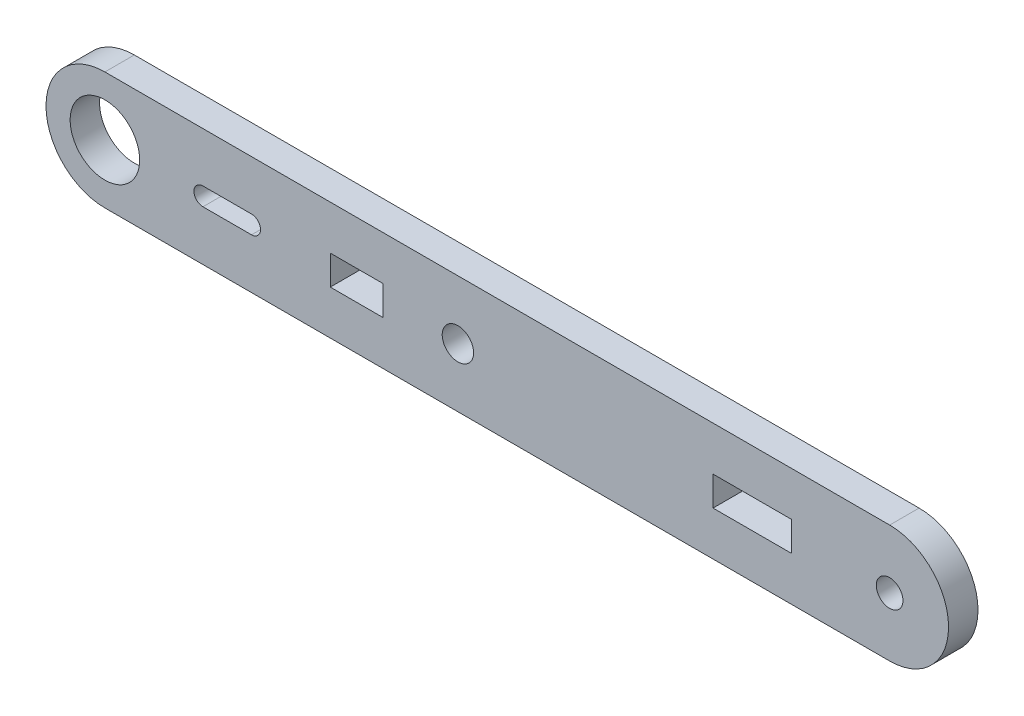
ISO-10303-21;
HEADER;
FILE_DESCRIPTION(('STEP AP214'),'2;1');
FILE_NAME('part.step','',(''),(''),'','','');
FILE_SCHEMA(('AUTOMOTIVE_DESIGN { 1 0 10303 214 1 1 1 1 }'));
ENDSEC;
DATA;
#1=APPLICATION_CONTEXT('core data for automotive mechanical design processes');
#2=APPLICATION_PROTOCOL_DEFINITION('international standard','automotive_design',2000,#1);
#3=PRODUCT_CONTEXT('',#1,'mechanical');
#4=PRODUCT('Part','Part','',(#3));
#5=PRODUCT_RELATED_PRODUCT_CATEGORY('part','',(#4));
#6=PRODUCT_DEFINITION_FORMATION('','',#4);
#7=PRODUCT_DEFINITION_CONTEXT('part definition',#1,'design');
#8=PRODUCT_DEFINITION('design','',#6,#7);
#9=PRODUCT_DEFINITION_SHAPE('','',#8);
#10=(LENGTH_UNIT() NAMED_UNIT(*) SI_UNIT(.MILLI.,.METRE.));
#11=(NAMED_UNIT(*) PLANE_ANGLE_UNIT() SI_UNIT($,.RADIAN.));
#12=(NAMED_UNIT(*) SI_UNIT($,.STERADIAN.) SOLID_ANGLE_UNIT());
#13=UNCERTAINTY_MEASURE_WITH_UNIT(LENGTH_MEASURE(1.E-05),#10,'distance_accuracy_value','');
#14=(GEOMETRIC_REPRESENTATION_CONTEXT(3) GLOBAL_UNCERTAINTY_ASSIGNED_CONTEXT((#13)) GLOBAL_UNIT_ASSIGNED_CONTEXT((#10,
#11,#12)) REPRESENTATION_CONTEXT('',''));
#15=CARTESIAN_POINT('',(0.,0.,0.));
#16=DIRECTION('',(0.,0.,1.));
#17=DIRECTION('',(1.,0.,0.));
#18=AXIS2_PLACEMENT_3D('',#15,#16,#17);
#19=CARTESIAN_POINT('',(30.6181719329405,6.,0.));
#20=DIRECTION('',(0.,0.,1.));
#21=DIRECTION('',(1.,0.,0.));
#22=AXIS2_PLACEMENT_3D('',#19,#20,#21);
#23=CYLINDRICAL_SURFACE('',#22,6.);
#24=CARTESIAN_POINT('',(30.6181719329405,6.,3.));
#25=DIRECTION('',(0.,0.,1.));
#26=DIRECTION('',(1.,0.,0.));
#27=AXIS2_PLACEMENT_3D('',#24,#25,#26);
#28=CIRCLE('',#27,6.);
#29=CARTESIAN_POINT('',(30.6181719329405,0.,3.));
#30=VERTEX_POINT('',#29);
#31=CARTESIAN_POINT('',(30.6181719329405,12.,3.));
#32=VERTEX_POINT('',#31);
#33=EDGE_CURVE('E300',#30,#32,#28,.T.);
#34=ORIENTED_EDGE('',*,*,#33,.F.);
#35=DIRECTION('',(0.,0.,1.));
#36=VECTOR('',#35,1.);
#37=CARTESIAN_POINT('',(30.6181719329405,0.,0.));
#38=LINE('',#37,#36);
#39=CARTESIAN_POINT('',(30.6181719329405,0.,0.));
#40=VERTEX_POINT('',#39);
#41=EDGE_CURVE('E11',#40,#30,#38,.T.);
#42=ORIENTED_EDGE('',*,*,#41,.F.);
#43=CARTESIAN_POINT('',(30.6181719329405,6.,0.));
#44=DIRECTION('',(0.,0.,1.));
#45=DIRECTION('',(1.,0.,0.));
#46=AXIS2_PLACEMENT_3D('',#43,#44,#45);
#47=CIRCLE('',#46,6.);
#48=CARTESIAN_POINT('',(30.6181719329405,12.,0.));
#49=VERTEX_POINT('',#48);
#50=EDGE_CURVE('E310',#40,#49,#47,.T.);
#51=ORIENTED_EDGE('',*,*,#50,.T.);
#52=DIRECTION('',(0.,0.,1.));
#53=VECTOR('',#52,1.);
#54=CARTESIAN_POINT('',(30.6181719329405,12.,0.));
#55=LINE('',#54,#53);
#56=EDGE_CURVE('E42',#49,#32,#55,.T.);
#57=ORIENTED_EDGE('',*,*,#56,.T.);
#58=EDGE_LOOP('',(#34,#42,#51,#57));
#59=FACE_BOUND('',#58,.T.);
#60=ADVANCED_FACE('F39',(#59),#23,.T.);
#61=CARTESIAN_POINT('',(-49.3435107871291,0.,0.));
#62=DIRECTION('',(0.,-1.,0.));
#63=DIRECTION('',(0.,0.,-1.));
#64=AXIS2_PLACEMENT_3D('',#61,#62,#63);
#65=PLANE('',#64);
#66=DIRECTION('',(1.,0.,0.));
#67=VECTOR('',#66,1.);
#68=CARTESIAN_POINT('',(-49.3435107871291,0.,3.));
#69=LINE('',#68,#67);
#70=CARTESIAN_POINT('',(-49.3435107871291,0.,3.));
#71=VERTEX_POINT('',#70);
#72=EDGE_CURVE('E315',#71,#30,#69,.T.);
#73=ORIENTED_EDGE('',*,*,#72,.F.);
#74=DIRECTION('',(0.,0.,1.));
#75=VECTOR('',#74,1.);
#76=CARTESIAN_POINT('',(-49.3435107871291,0.,0.));
#77=LINE('',#76,#75);
#78=CARTESIAN_POINT('',(-49.3435107871291,0.,0.));
#79=VERTEX_POINT('',#78);
#80=EDGE_CURVE('E48',#79,#71,#77,.T.);
#81=ORIENTED_EDGE('',*,*,#80,.F.);
#82=DIRECTION('',(1.,0.,0.));
#83=VECTOR('',#82,1.);
#84=CARTESIAN_POINT('',(-49.3435107871291,0.,0.));
#85=LINE('',#84,#83);
#86=EDGE_CURVE('E323',#79,#40,#85,.T.);
#87=ORIENTED_EDGE('',*,*,#86,.T.);
#88=ORIENTED_EDGE('',*,*,#41,.T.);
#89=EDGE_LOOP('',(#73,#81,#87,#88));
#90=FACE_BOUND('',#89,.T.);
#91=ADVANCED_FACE('F357',(#90),#65,.T.);
#92=CARTESIAN_POINT('',(-49.3435107871291,6.,0.));
#93=DIRECTION('',(0.,0.,1.));
#94=DIRECTION('',(1.,0.,0.));
#95=AXIS2_PLACEMENT_3D('',#92,#93,#94);
#96=CYLINDRICAL_SURFACE('',#95,6.);
#97=CARTESIAN_POINT('',(-49.3435107871291,6.,3.));
#98=DIRECTION('',(0.,0.,1.));
#99=DIRECTION('',(1.,0.,0.));
#100=AXIS2_PLACEMENT_3D('',#97,#98,#99);
#101=CIRCLE('',#100,6.);
#102=CARTESIAN_POINT('',(-49.3435107871291,12.,3.));
#103=VERTEX_POINT('',#102);
#104=EDGE_CURVE('E334',#103,#71,#101,.T.);
#105=ORIENTED_EDGE('',*,*,#104,.F.);
#106=DIRECTION('',(0.,0.,1.));
#107=VECTOR('',#106,1.);
#108=CARTESIAN_POINT('',(-49.3435107871291,12.,0.));
#109=LINE('',#108,#107);
#110=CARTESIAN_POINT('',(-49.3435107871291,12.,0.));
#111=VERTEX_POINT('',#110);
#112=EDGE_CURVE('E342',#111,#103,#109,.T.);
#113=ORIENTED_EDGE('',*,*,#112,.F.);
#114=CARTESIAN_POINT('',(-49.3435107871291,6.,0.));
#115=DIRECTION('',(0.,0.,1.));
#116=DIRECTION('',(1.,0.,0.));
#117=AXIS2_PLACEMENT_3D('',#114,#115,#116);
#118=CIRCLE('',#117,6.);
#119=EDGE_CURVE('E319',#111,#79,#118,.T.);
#120=ORIENTED_EDGE('',*,*,#119,.T.);
#121=ORIENTED_EDGE('',*,*,#80,.T.);
#122=EDGE_LOOP('',(#105,#113,#120,#121));
#123=FACE_BOUND('',#122,.T.);
#124=ADVANCED_FACE('F362',(#123),#96,.T.);
#125=CARTESIAN_POINT('',(30.6181719329405,12.,0.));
#126=DIRECTION('',(0.,1.,0.));
#127=DIRECTION('',(0.,0.,1.));
#128=AXIS2_PLACEMENT_3D('',#125,#126,#127);
#129=PLANE('',#128);
#130=DIRECTION('',(-1.,0.,0.));
#131=VECTOR('',#130,1.);
#132=CARTESIAN_POINT('',(30.6181719329405,12.,3.));
#133=LINE('',#132,#131);
#134=EDGE_CURVE('E330',#32,#103,#133,.T.);
#135=ORIENTED_EDGE('',*,*,#134,.F.);
#136=ORIENTED_EDGE('',*,*,#56,.F.);
#137=DIRECTION('',(-1.,0.,0.));
#138=VECTOR('',#137,1.);
#139=CARTESIAN_POINT('',(30.6181719329405,12.,0.));
#140=LINE('',#139,#138);
#141=EDGE_CURVE('E314',#49,#111,#140,.T.);
#142=ORIENTED_EDGE('',*,*,#141,.T.);
#143=ORIENTED_EDGE('',*,*,#112,.T.);
#144=EDGE_LOOP('',(#135,#136,#142,#143));
#145=FACE_BOUND('',#144,.T.);
#146=ADVANCED_FACE('F352',(#145),#129,.T.);
#147=CARTESIAN_POINT('',(30.6181719329405,6.,0.));
#148=DIRECTION('',(0.,0.,1.));
#149=DIRECTION('',(1.,0.,0.));
#150=AXIS2_PLACEMENT_3D('',#147,#148,#149);
#151=PLANE('',#150);
#152=CARTESIAN_POINT('',(-13.3753433024024,6.0002,0.));
#153=DIRECTION('',(0.,0.,1.));
#154=DIRECTION('',(1.,0.,0.));
#155=AXIS2_PLACEMENT_3D('',#152,#153,#154);
#156=CIRCLE('',#155,1.6);
#157=CARTESIAN_POINT('',(-11.7753433024024,6.0002,0.));
#158=VERTEX_POINT('',#157);
#159=EDGE_CURVE('E191',#158,#158,#156,.T.);
#160=ORIENTED_EDGE('',*,*,#159,.T.);
#161=EDGE_LOOP('',(#160));
#162=FACE_BOUND('',#161,.T.);
#163=DIRECTION('',(1.,0.,0.));
#164=VECTOR('',#163,1.);
#165=CARTESIAN_POINT('',(-34.4047390861018,5.1001,0.));
#166=LINE('',#165,#164);
#167=CARTESIAN_POINT('',(-39.3523475187029,5.10009999999999,0.));
#168=VERTEX_POINT('',#167);
#169=CARTESIAN_POINT('',(-34.4047390861018,5.1001,0.));
#170=VERTEX_POINT('',#169);
#171=EDGE_CURVE('E162',#168,#170,#166,.T.);
#172=ORIENTED_EDGE('',*,*,#171,.T.);
#173=CARTESIAN_POINT('',(-34.4047390861018,6.01717646772261,0.));
#174=DIRECTION('',(0.,0.,1.));
#175=DIRECTION('',(-1.,0.,0.));
#176=AXIS2_PLACEMENT_3D('',#173,#174,#175);
#177=CIRCLE('',#176,0.917076467722615);
#178=CARTESIAN_POINT('',(-34.4047390861018,6.93425293544523,0.));
#179=VERTEX_POINT('',#178);
#180=EDGE_CURVE('E155',#170,#179,#177,.T.);
#181=ORIENTED_EDGE('',*,*,#180,.T.);
#182=DIRECTION('',(-1.,0.,0.));
#183=VECTOR('',#182,1.);
#184=CARTESIAN_POINT('',(-39.3523475187029,6.93425293544523,0.));
#185=LINE('',#184,#183);
#186=CARTESIAN_POINT('',(-39.3523475187029,6.93425293544523,0.));
#187=VERTEX_POINT('',#186);
#188=EDGE_CURVE('E165',#179,#187,#185,.T.);
#189=ORIENTED_EDGE('',*,*,#188,.T.);
#190=CARTESIAN_POINT('',(-39.3523475187029,6.01717646772261,0.));
#191=DIRECTION('',(0.,0.,1.));
#192=DIRECTION('',(-1.,0.,0.));
#193=AXIS2_PLACEMENT_3D('',#190,#191,#192);
#194=CIRCLE('',#193,0.917076467722618);
#195=EDGE_CURVE('E56',#187,#168,#194,.T.);
#196=ORIENTED_EDGE('',*,*,#195,.T.);
#197=EDGE_LOOP('',(#172,#181,#189,#196));
#198=FACE_BOUND('',#197,.T.);
#199=CARTESIAN_POINT('',(-49.3435107871291,6.,0.));
#200=DIRECTION('',(0.,0.,1.));
#201=DIRECTION('',(-1.,0.,0.));
#202=AXIS2_PLACEMENT_3D('',#199,#200,#201);
#203=CIRCLE('',#202,3.54382579565862);
#204=CARTESIAN_POINT('',(-52.8873365827877,6.,0.));
#205=VERTEX_POINT('',#204);
#206=EDGE_CURVE('E206',#205,#205,#203,.T.);
#207=ORIENTED_EDGE('',*,*,#206,.T.);
#208=EDGE_LOOP('',(#207));
#209=FACE_BOUND('',#208,.T.);
#210=CARTESIAN_POINT('',(30.6116066975977,6.0001,0.));
#211=DIRECTION('',(0.,0.,1.));
#212=DIRECTION('',(-1.,0.,0.));
#213=AXIS2_PLACEMENT_3D('',#210,#211,#212);
#214=CIRCLE('',#213,1.35759106374035);
#215=CARTESIAN_POINT('',(29.2540156338573,6.0001,0.));
#216=VERTEX_POINT('',#215);
#217=EDGE_CURVE('E214',#216,#216,#214,.T.);
#218=ORIENTED_EDGE('',*,*,#217,.T.);
#219=EDGE_LOOP('',(#218));
#220=FACE_BOUND('',#219,.T.);
#221=DIRECTION('',(-1.,0.,0.));
#222=VECTOR('',#221,1.);
#223=CARTESIAN_POINT('',(12.6221066975976,7.4995,0.));
#224=LINE('',#223,#222);
#225=CARTESIAN_POINT('',(20.6213066975977,7.4995,0.));
#226=VERTEX_POINT('',#225);
#227=CARTESIAN_POINT('',(12.6221066975976,7.4995,0.));
#228=VERTEX_POINT('',#227);
#229=EDGE_CURVE('E235',#226,#228,#224,.T.);
#230=ORIENTED_EDGE('',*,*,#229,.T.);
#231=DIRECTION('',(0.,-1.,0.));
#232=VECTOR('',#231,1.);
#233=CARTESIAN_POINT('',(12.6221066975976,4.4994,0.));
#234=LINE('',#233,#232);
#235=CARTESIAN_POINT('',(12.6221066975976,4.4994,0.));
#236=VERTEX_POINT('',#235);
#237=EDGE_CURVE('E222',#228,#236,#234,.T.);
#238=ORIENTED_EDGE('',*,*,#237,.T.);
#239=DIRECTION('',(1.,0.,0.));
#240=VECTOR('',#239,1.);
#241=CARTESIAN_POINT('',(20.6213066975977,4.4994,0.));
#242=LINE('',#241,#240);
#243=CARTESIAN_POINT('',(20.6213066975977,4.4994,0.));
#244=VERTEX_POINT('',#243);
#245=EDGE_CURVE('E226',#236,#244,#242,.T.);
#246=ORIENTED_EDGE('',*,*,#245,.T.);
#247=DIRECTION('',(0.,1.,0.));
#248=VECTOR('',#247,1.);
#249=CARTESIAN_POINT('',(20.6213066975977,7.4995,0.));
#250=LINE('',#249,#248);
#251=EDGE_CURVE('E231',#244,#226,#250,.T.);
#252=ORIENTED_EDGE('',*,*,#251,.T.);
#253=EDGE_LOOP('',(#230,#238,#246,#252));
#254=FACE_BOUND('',#253,.T.);
#255=DIRECTION('',(-1.,0.,0.));
#256=VECTOR('',#255,1.);
#257=CARTESIAN_POINT('',(-26.3777933024023,7.4995,0.));
#258=LINE('',#257,#256);
#259=CARTESIAN_POINT('',(-21.0049933024024,7.4995,0.));
#260=VERTEX_POINT('',#259);
#261=CARTESIAN_POINT('',(-26.3777933024023,7.4995,0.));
#262=VERTEX_POINT('',#261);
#263=EDGE_CURVE('E279',#260,#262,#258,.T.);
#264=ORIENTED_EDGE('',*,*,#263,.T.);
#265=DIRECTION('',(0.,-1.,0.));
#266=VECTOR('',#265,1.);
#267=CARTESIAN_POINT('',(-26.3777933024023,4.4994,0.));
#268=LINE('',#267,#266);
#269=CARTESIAN_POINT('',(-26.3777933024023,4.4994,0.));
#270=VERTEX_POINT('',#269);
#271=EDGE_CURVE('E266',#262,#270,#268,.T.);
#272=ORIENTED_EDGE('',*,*,#271,.T.);
#273=DIRECTION('',(1.,0.,0.));
#274=VECTOR('',#273,1.);
#275=CARTESIAN_POINT('',(-21.0049933024024,4.4994,0.));
#276=LINE('',#275,#274);
#277=CARTESIAN_POINT('',(-21.0049933024024,4.4994,0.));
#278=VERTEX_POINT('',#277);
#279=EDGE_CURVE('E270',#270,#278,#276,.T.);
#280=ORIENTED_EDGE('',*,*,#279,.T.);
#281=DIRECTION('',(0.,1.,0.));
#282=VECTOR('',#281,1.);
#283=CARTESIAN_POINT('',(-21.0049933024024,7.4995,0.));
#284=LINE('',#283,#282);
#285=EDGE_CURVE('E275',#278,#260,#284,.T.);
#286=ORIENTED_EDGE('',*,*,#285,.T.);
#287=EDGE_LOOP('',(#264,#272,#280,#286));
#288=FACE_BOUND('',#287,.T.);
#289=ORIENTED_EDGE('',*,*,#50,.F.);
#290=ORIENTED_EDGE('',*,*,#86,.F.);
#291=ORIENTED_EDGE('',*,*,#119,.F.);
#292=ORIENTED_EDGE('',*,*,#141,.F.);
#293=EDGE_LOOP('',(#289,#290,#291,#292));
#294=FACE_BOUND('',#293,.T.);
#295=ADVANCED_FACE('F170',(#162,#198,#209,#220,#254,#288,#294),#151,.F.);
#296=CARTESIAN_POINT('',(30.6181719329405,6.,3.));
#297=DIRECTION('',(0.,0.,1.));
#298=DIRECTION('',(1.,0.,0.));
#299=AXIS2_PLACEMENT_3D('',#296,#297,#298);
#300=PLANE('',#299);
#301=CARTESIAN_POINT('',(-13.3753433024024,6.0002,3.));
#302=DIRECTION('',(0.,0.,1.));
#303=DIRECTION('',(1.,0.,0.));
#304=AXIS2_PLACEMENT_3D('',#301,#302,#303);
#305=CIRCLE('',#304,1.6);
#306=CARTESIAN_POINT('',(-11.7753433024024,6.0002,3.));
#307=VERTEX_POINT('',#306);
#308=EDGE_CURVE('E181',#307,#307,#305,.T.);
#309=ORIENTED_EDGE('',*,*,#308,.F.);
#310=EDGE_LOOP('',(#309));
#311=FACE_BOUND('',#310,.T.);
#312=CARTESIAN_POINT('',(-34.4047390861018,6.01717646772261,3.));
#313=DIRECTION('',(0.,0.,1.));
#314=DIRECTION('',(-1.,0.,0.));
#315=AXIS2_PLACEMENT_3D('',#312,#313,#314);
#316=CIRCLE('',#315,0.917076467722615);
#317=CARTESIAN_POINT('',(-34.4047390861018,5.1001,3.));
#318=VERTEX_POINT('',#317);
#319=CARTESIAN_POINT('',(-34.4047390861018,6.93425293544523,3.));
#320=VERTEX_POINT('',#319);
#321=EDGE_CURVE('E64',#318,#320,#316,.T.);
#322=ORIENTED_EDGE('',*,*,#321,.F.);
#323=DIRECTION('',(1.,0.,0.));
#324=VECTOR('',#323,1.);
#325=CARTESIAN_POINT('',(-34.4047390861018,5.1001,3.));
#326=LINE('',#325,#324);
#327=CARTESIAN_POINT('',(-39.3523475187029,5.10009999999999,3.));
#328=VERTEX_POINT('',#327);
#329=EDGE_CURVE('E174',#328,#318,#326,.T.);
#330=ORIENTED_EDGE('',*,*,#329,.F.);
#331=CARTESIAN_POINT('',(-39.3523475187029,6.01717646772261,3.));
#332=DIRECTION('',(0.,0.,1.));
#333=DIRECTION('',(-1.,0.,0.));
#334=AXIS2_PLACEMENT_3D('',#331,#332,#333);
#335=CIRCLE('',#334,0.917076467722618);
#336=CARTESIAN_POINT('',(-39.3523475187029,6.93425293544523,3.));
#337=VERTEX_POINT('',#336);
#338=EDGE_CURVE('E178',#337,#328,#335,.T.);
#339=ORIENTED_EDGE('',*,*,#338,.F.);
#340=DIRECTION('',(-1.,0.,0.));
#341=VECTOR('',#340,1.);
#342=CARTESIAN_POINT('',(-39.3523475187029,6.93425293544523,3.));
#343=LINE('',#342,#341);
#344=EDGE_CURVE('E190',#320,#337,#343,.T.);
#345=ORIENTED_EDGE('',*,*,#344,.F.);
#346=EDGE_LOOP('',(#322,#330,#339,#345));
#347=FACE_BOUND('',#346,.T.);
#348=CARTESIAN_POINT('',(-49.3435107871291,6.,3.));
#349=DIRECTION('',(0.,0.,1.));
#350=DIRECTION('',(-1.,0.,0.));
#351=AXIS2_PLACEMENT_3D('',#348,#349,#350);
#352=CIRCLE('',#351,3.54382579565862);
#353=CARTESIAN_POINT('',(-52.8873365827877,6.,3.));
#354=VERTEX_POINT('',#353);
#355=EDGE_CURVE('E200',#354,#354,#352,.T.);
#356=ORIENTED_EDGE('',*,*,#355,.F.);
#357=EDGE_LOOP('',(#356));
#358=FACE_BOUND('',#357,.T.);
#359=CARTESIAN_POINT('',(30.6116066975977,6.0001,3.));
#360=DIRECTION('',(0.,0.,1.));
#361=DIRECTION('',(-1.,0.,0.));
#362=AXIS2_PLACEMENT_3D('',#359,#360,#361);
#363=CIRCLE('',#362,1.35759106374035);
#364=CARTESIAN_POINT('',(29.2540156338573,6.0001,3.));
#365=VERTEX_POINT('',#364);
#366=EDGE_CURVE('E210',#365,#365,#363,.T.);
#367=ORIENTED_EDGE('',*,*,#366,.F.);
#368=EDGE_LOOP('',(#367));
#369=FACE_BOUND('',#368,.T.);
#370=DIRECTION('',(0.,-1.,0.));
#371=VECTOR('',#370,1.);
#372=CARTESIAN_POINT('',(12.6221066975976,4.4994,3.));
#373=LINE('',#372,#371);
#374=CARTESIAN_POINT('',(12.6221066975976,7.4995,3.));
#375=VERTEX_POINT('',#374);
#376=CARTESIAN_POINT('',(12.6221066975976,4.4994,3.));
#377=VERTEX_POINT('',#376);
#378=EDGE_CURVE('E218',#375,#377,#373,.T.);
#379=ORIENTED_EDGE('',*,*,#378,.F.);
#380=DIRECTION('',(-1.,0.,0.));
#381=VECTOR('',#380,1.);
#382=CARTESIAN_POINT('',(12.6221066975976,7.4995,3.));
#383=LINE('',#382,#381);
#384=CARTESIAN_POINT('',(20.6213066975977,7.4995,3.));
#385=VERTEX_POINT('',#384);
#386=EDGE_CURVE('E227',#385,#375,#383,.T.);
#387=ORIENTED_EDGE('',*,*,#386,.F.);
#388=DIRECTION('',(0.,1.,0.));
#389=VECTOR('',#388,1.);
#390=CARTESIAN_POINT('',(20.6213066975977,7.4995,3.));
#391=LINE('',#390,#389);
#392=CARTESIAN_POINT('',(20.6213066975977,4.4994,3.));
#393=VERTEX_POINT('',#392);
#394=EDGE_CURVE('E246',#393,#385,#391,.T.);
#395=ORIENTED_EDGE('',*,*,#394,.F.);
#396=DIRECTION('',(1.,0.,0.));
#397=VECTOR('',#396,1.);
#398=CARTESIAN_POINT('',(20.6213066975977,4.4994,3.));
#399=LINE('',#398,#397);
#400=EDGE_CURVE('E242',#377,#393,#399,.T.);
#401=ORIENTED_EDGE('',*,*,#400,.F.);
#402=EDGE_LOOP('',(#379,#387,#395,#401));
#403=FACE_BOUND('',#402,.T.);
#404=DIRECTION('',(0.,-1.,0.));
#405=VECTOR('',#404,1.);
#406=CARTESIAN_POINT('',(-26.3777933024023,4.4994,3.));
#407=LINE('',#406,#405);
#408=CARTESIAN_POINT('',(-26.3777933024023,7.4995,3.));
#409=VERTEX_POINT('',#408);
#410=CARTESIAN_POINT('',(-26.3777933024023,4.4994,3.));
#411=VERTEX_POINT('',#410);
#412=EDGE_CURVE('E256',#409,#411,#407,.T.);
#413=ORIENTED_EDGE('',*,*,#412,.F.);
#414=DIRECTION('',(-1.,0.,0.));
#415=VECTOR('',#414,1.);
#416=CARTESIAN_POINT('',(-26.3777933024023,7.4995,3.));
#417=LINE('',#416,#415);
#418=CARTESIAN_POINT('',(-21.0049933024024,7.4995,3.));
#419=VERTEX_POINT('',#418);
#420=EDGE_CURVE('E271',#419,#409,#417,.T.);
#421=ORIENTED_EDGE('',*,*,#420,.F.);
#422=DIRECTION('',(0.,1.,0.));
#423=VECTOR('',#422,1.);
#424=CARTESIAN_POINT('',(-21.0049933024024,7.4995,3.));
#425=LINE('',#424,#423);
#426=CARTESIAN_POINT('',(-21.0049933024024,4.4994,3.));
#427=VERTEX_POINT('',#426);
#428=EDGE_CURVE('E290',#427,#419,#425,.T.);
#429=ORIENTED_EDGE('',*,*,#428,.F.);
#430=DIRECTION('',(1.,0.,0.));
#431=VECTOR('',#430,1.);
#432=CARTESIAN_POINT('',(-21.0049933024024,4.4994,3.));
#433=LINE('',#432,#431);
#434=EDGE_CURVE('E286',#411,#427,#433,.T.);
#435=ORIENTED_EDGE('',*,*,#434,.F.);
#436=EDGE_LOOP('',(#413,#421,#429,#435));
#437=FACE_BOUND('',#436,.T.);
#438=ORIENTED_EDGE('',*,*,#33,.T.);
#439=ORIENTED_EDGE('',*,*,#134,.T.);
#440=ORIENTED_EDGE('',*,*,#104,.T.);
#441=ORIENTED_EDGE('',*,*,#72,.T.);
#442=EDGE_LOOP('',(#438,#439,#440,#441));
#443=FACE_BOUND('',#442,.T.);
#444=ADVANCED_FACE('F354',(#311,#347,#358,#369,#403,#437,#443),#300,.T.);
#445=CARTESIAN_POINT('',(-26.3777933024023,4.4994,0.));
#446=DIRECTION('',(-1.,0.,0.));
#447=DIRECTION('',(0.,0.,1.));
#448=AXIS2_PLACEMENT_3D('',#445,#446,#447);
#449=PLANE('',#448);
#450=ORIENTED_EDGE('',*,*,#412,.T.);
#451=DIRECTION('',(0.,0.,1.));
#452=VECTOR('',#451,1.);
#453=CARTESIAN_POINT('',(-26.3777933024023,4.4994,0.));
#454=LINE('',#453,#452);
#455=EDGE_CURVE('E283',#270,#411,#454,.T.);
#456=ORIENTED_EDGE('',*,*,#455,.F.);
#457=ORIENTED_EDGE('',*,*,#271,.F.);
#458=DIRECTION('',(0.,0.,1.));
#459=VECTOR('',#458,1.);
#460=CARTESIAN_POINT('',(-26.3777933024023,7.4995,0.));
#461=LINE('',#460,#459);
#462=EDGE_CURVE('E297',#262,#409,#461,.T.);
#463=ORIENTED_EDGE('',*,*,#462,.T.);
#464=EDGE_LOOP('',(#450,#456,#457,#463));
#465=FACE_BOUND('',#464,.T.);
#466=ADVANCED_FACE('F394',(#465),#449,.F.);
#467=CARTESIAN_POINT('',(-26.3777933024023,7.4995,0.));
#468=DIRECTION('',(0.,1.,0.));
#469=DIRECTION('',(0.,0.,1.));
#470=AXIS2_PLACEMENT_3D('',#467,#468,#469);
#471=PLANE('',#470);
#472=ORIENTED_EDGE('',*,*,#420,.T.);
#473=ORIENTED_EDGE('',*,*,#462,.F.);
#474=ORIENTED_EDGE('',*,*,#263,.F.);
#475=DIRECTION('',(0.,0.,1.));
#476=VECTOR('',#475,1.);
#477=CARTESIAN_POINT('',(-21.0049933024024,7.4995,0.));
#478=LINE('',#477,#476);
#479=EDGE_CURVE('E301',#260,#419,#478,.T.);
#480=ORIENTED_EDGE('',*,*,#479,.T.);
#481=EDGE_LOOP('',(#472,#473,#474,#480));
#482=FACE_BOUND('',#481,.T.);
#483=ADVANCED_FACE('F399',(#482),#471,.F.);
#484=CARTESIAN_POINT('',(-21.0049933024024,7.4995,0.));
#485=DIRECTION('',(1.,0.,0.));
#486=DIRECTION('',(0.,0.,-1.));
#487=AXIS2_PLACEMENT_3D('',#484,#485,#486);
#488=PLANE('',#487);
#489=ORIENTED_EDGE('',*,*,#428,.T.);
#490=ORIENTED_EDGE('',*,*,#479,.F.);
#491=ORIENTED_EDGE('',*,*,#285,.F.);
#492=DIRECTION('',(0.,0.,1.));
#493=VECTOR('',#492,1.);
#494=CARTESIAN_POINT('',(-21.0049933024024,4.4994,0.));
#495=LINE('',#494,#493);
#496=EDGE_CURVE('E304',#278,#427,#495,.T.);
#497=ORIENTED_EDGE('',*,*,#496,.T.);
#498=EDGE_LOOP('',(#489,#490,#491,#497));
#499=FACE_BOUND('',#498,.T.);
#500=ADVANCED_FACE('F411',(#499),#488,.F.);
#501=CARTESIAN_POINT('',(-21.0049933024024,4.4994,0.));
#502=DIRECTION('',(0.,-1.,0.));
#503=DIRECTION('',(0.,0.,-1.));
#504=AXIS2_PLACEMENT_3D('',#501,#502,#503);
#505=PLANE('',#504);
#506=ORIENTED_EDGE('',*,*,#434,.T.);
#507=ORIENTED_EDGE('',*,*,#496,.F.);
#508=ORIENTED_EDGE('',*,*,#279,.F.);
#509=ORIENTED_EDGE('',*,*,#455,.T.);
#510=EDGE_LOOP('',(#506,#507,#508,#509));
#511=FACE_BOUND('',#510,.T.);
#512=ADVANCED_FACE('F421',(#511),#505,.F.);
#513=CARTESIAN_POINT('',(12.6221066975976,4.4994,0.));
#514=DIRECTION('',(-1.,0.,0.));
#515=DIRECTION('',(0.,0.,1.));
#516=AXIS2_PLACEMENT_3D('',#513,#514,#515);
#517=PLANE('',#516);
#518=ORIENTED_EDGE('',*,*,#378,.T.);
#519=DIRECTION('',(0.,0.,1.));
#520=VECTOR('',#519,1.);
#521=CARTESIAN_POINT('',(12.6221066975976,4.4994,0.));
#522=LINE('',#521,#520);
#523=EDGE_CURVE('E239',#236,#377,#522,.T.);
#524=ORIENTED_EDGE('',*,*,#523,.F.);
#525=ORIENTED_EDGE('',*,*,#237,.F.);
#526=DIRECTION('',(0.,0.,1.));
#527=VECTOR('',#526,1.);
#528=CARTESIAN_POINT('',(12.6221066975976,7.4995,0.));
#529=LINE('',#528,#527);
#530=EDGE_CURVE('E253',#228,#375,#529,.T.);
#531=ORIENTED_EDGE('',*,*,#530,.T.);
#532=EDGE_LOOP('',(#518,#524,#525,#531));
#533=FACE_BOUND('',#532,.T.);
#534=ADVANCED_FACE('F431',(#533),#517,.F.);
#535=CARTESIAN_POINT('',(12.6221066975976,7.4995,0.));
#536=DIRECTION('',(0.,1.,0.));
#537=DIRECTION('',(0.,0.,1.));
#538=AXIS2_PLACEMENT_3D('',#535,#536,#537);
#539=PLANE('',#538);
#540=ORIENTED_EDGE('',*,*,#386,.T.);
#541=ORIENTED_EDGE('',*,*,#530,.F.);
#542=ORIENTED_EDGE('',*,*,#229,.F.);
#543=DIRECTION('',(0.,0.,1.));
#544=VECTOR('',#543,1.);
#545=CARTESIAN_POINT('',(20.6213066975977,7.4995,0.));
#546=LINE('',#545,#544);
#547=EDGE_CURVE('E257',#226,#385,#546,.T.);
#548=ORIENTED_EDGE('',*,*,#547,.T.);
#549=EDGE_LOOP('',(#540,#541,#542,#548));
#550=FACE_BOUND('',#549,.T.);
#551=ADVANCED_FACE('F441',(#550),#539,.F.);
#552=CARTESIAN_POINT('',(20.6213066975977,7.4995,0.));
#553=DIRECTION('',(1.,0.,0.));
#554=DIRECTION('',(0.,0.,-1.));
#555=AXIS2_PLACEMENT_3D('',#552,#553,#554);
#556=PLANE('',#555);
#557=ORIENTED_EDGE('',*,*,#394,.T.);
#558=ORIENTED_EDGE('',*,*,#547,.F.);
#559=ORIENTED_EDGE('',*,*,#251,.F.);
#560=DIRECTION('',(0.,0.,1.));
#561=VECTOR('',#560,1.);
#562=CARTESIAN_POINT('',(20.6213066975977,4.4994,0.));
#563=LINE('',#562,#561);
#564=EDGE_CURVE('E260',#244,#393,#563,.T.);
#565=ORIENTED_EDGE('',*,*,#564,.T.);
#566=EDGE_LOOP('',(#557,#558,#559,#565));
#567=FACE_BOUND('',#566,.T.);
#568=ADVANCED_FACE('F451',(#567),#556,.F.);
#569=CARTESIAN_POINT('',(20.6213066975977,4.4994,0.));
#570=DIRECTION('',(0.,-1.,0.));
#571=DIRECTION('',(0.,0.,-1.));
#572=AXIS2_PLACEMENT_3D('',#569,#570,#571);
#573=PLANE('',#572);
#574=ORIENTED_EDGE('',*,*,#400,.T.);
#575=ORIENTED_EDGE('',*,*,#564,.F.);
#576=ORIENTED_EDGE('',*,*,#245,.F.);
#577=ORIENTED_EDGE('',*,*,#523,.T.);
#578=EDGE_LOOP('',(#574,#575,#576,#577));
#579=FACE_BOUND('',#578,.T.);
#580=ADVANCED_FACE('F461',(#579),#573,.F.);
#581=CARTESIAN_POINT('',(30.6116066975977,6.0001,0.));
#582=DIRECTION('',(0.,0.,1.));
#583=DIRECTION('',(1.,0.,0.));
#584=AXIS2_PLACEMENT_3D('',#581,#582,#583);
#585=CYLINDRICAL_SURFACE('',#584,1.35759106374035);
#586=ORIENTED_EDGE('',*,*,#217,.F.);
#587=EDGE_LOOP('',(#586));
#588=FACE_BOUND('',#587,.T.);
#589=ORIENTED_EDGE('',*,*,#366,.T.);
#590=EDGE_LOOP('',(#589));
#591=FACE_BOUND('',#590,.T.);
#592=ADVANCED_FACE('F471',(#588,#591),#585,.F.);
#593=CARTESIAN_POINT('',(-49.3435107871291,6.,0.));
#594=DIRECTION('',(0.,0.,1.));
#595=DIRECTION('',(1.,0.,0.));
#596=AXIS2_PLACEMENT_3D('',#593,#594,#595);
#597=CYLINDRICAL_SURFACE('',#596,3.54382579565862);
#598=ORIENTED_EDGE('',*,*,#206,.F.);
#599=EDGE_LOOP('',(#598));
#600=FACE_BOUND('',#599,.T.);
#601=ORIENTED_EDGE('',*,*,#355,.T.);
#602=EDGE_LOOP('',(#601));
#603=FACE_BOUND('',#602,.T.);
#604=ADVANCED_FACE('F481',(#600,#603),#597,.F.);
#605=CARTESIAN_POINT('',(-34.4047390861018,6.01717646772261,0.));
#606=DIRECTION('',(0.,0.,1.));
#607=DIRECTION('',(1.,0.,0.));
#608=AXIS2_PLACEMENT_3D('',#605,#606,#607);
#609=CYLINDRICAL_SURFACE('',#608,0.917076467722615);
#610=ORIENTED_EDGE('',*,*,#321,.T.);
#611=DIRECTION('',(0.,0.,1.));
#612=VECTOR('',#611,1.);
#613=CARTESIAN_POINT('',(-34.4047390861018,6.93425293544523,0.));
#614=LINE('',#613,#612);
#615=EDGE_CURVE('E151',#179,#320,#614,.T.);
#616=ORIENTED_EDGE('',*,*,#615,.F.);
#617=ORIENTED_EDGE('',*,*,#180,.F.);
#618=DIRECTION('',(0.,0.,1.));
#619=VECTOR('',#618,1.);
#620=CARTESIAN_POINT('',(-34.4047390861018,5.1001,0.));
#621=LINE('',#620,#619);
#622=EDGE_CURVE('E197',#170,#318,#621,.T.);
#623=ORIENTED_EDGE('',*,*,#622,.T.);
#624=EDGE_LOOP('',(#610,#616,#617,#623));
#625=FACE_BOUND('',#624,.T.);
#626=ADVANCED_FACE('F153',(#625),#609,.F.);
#627=CARTESIAN_POINT('',(-34.4047390861018,5.1001,0.));
#628=DIRECTION('',(0.,-1.,0.));
#629=DIRECTION('',(1.,0.,0.));
#630=AXIS2_PLACEMENT_3D('',#627,#628,#629);
#631=PLANE('',#630);
#632=ORIENTED_EDGE('',*,*,#329,.T.);
#633=ORIENTED_EDGE('',*,*,#622,.F.);
#634=ORIENTED_EDGE('',*,*,#171,.F.);
#635=DIRECTION('',(0.,0.,1.));
#636=VECTOR('',#635,1.);
#637=CARTESIAN_POINT('',(-39.3523475187029,5.10009999999999,0.));
#638=LINE('',#637,#636);
#639=EDGE_CURVE('E201',#168,#328,#638,.T.);
#640=ORIENTED_EDGE('',*,*,#639,.T.);
#641=EDGE_LOOP('',(#632,#633,#634,#640));
#642=FACE_BOUND('',#641,.T.);
#643=ADVANCED_FACE('F500',(#642),#631,.F.);
#644=CARTESIAN_POINT('',(-39.3523475187029,6.01717646772261,0.));
#645=DIRECTION('',(0.,0.,1.));
#646=DIRECTION('',(1.,0.,0.));
#647=AXIS2_PLACEMENT_3D('',#644,#645,#646);
#648=CYLINDRICAL_SURFACE('',#647,0.917076467722618);
#649=ORIENTED_EDGE('',*,*,#338,.T.);
#650=ORIENTED_EDGE('',*,*,#639,.F.);
#651=ORIENTED_EDGE('',*,*,#195,.F.);
#652=DIRECTION('',(0.,0.,1.));
#653=VECTOR('',#652,1.);
#654=CARTESIAN_POINT('',(-39.3523475187029,6.93425293544523,0.));
#655=LINE('',#654,#653);
#656=EDGE_CURVE('E161',#187,#337,#655,.T.);
#657=ORIENTED_EDGE('',*,*,#656,.T.);
#658=EDGE_LOOP('',(#649,#650,#651,#657));
#659=FACE_BOUND('',#658,.T.);
#660=ADVANCED_FACE('F509',(#659),#648,.F.);
#661=CARTESIAN_POINT('',(-39.3523475187029,6.93425293544523,0.));
#662=DIRECTION('',(0.,1.,0.));
#663=DIRECTION('',(0.,0.,1.));
#664=AXIS2_PLACEMENT_3D('',#661,#662,#663);
#665=PLANE('',#664);
#666=ORIENTED_EDGE('',*,*,#344,.T.);
#667=ORIENTED_EDGE('',*,*,#656,.F.);
#668=ORIENTED_EDGE('',*,*,#188,.F.);
#669=ORIENTED_EDGE('',*,*,#615,.T.);
#670=EDGE_LOOP('',(#666,#667,#668,#669));
#671=FACE_BOUND('',#670,.T.);
#672=ADVANCED_FACE('F166',(#671),#665,.F.);
#673=CARTESIAN_POINT('',(-13.3753433024024,6.0002,0.));
#674=DIRECTION('',(0.,0.,1.));
#675=DIRECTION('',(1.,0.,0.));
#676=AXIS2_PLACEMENT_3D('',#673,#674,#675);
#677=CYLINDRICAL_SURFACE('',#676,1.6);
#678=ORIENTED_EDGE('',*,*,#159,.F.);
#679=EDGE_LOOP('',(#678));
#680=FACE_BOUND('',#679,.T.);
#681=ORIENTED_EDGE('',*,*,#308,.T.);
#682=EDGE_LOOP('',(#681));
#683=FACE_BOUND('',#682,.T.);
#684=ADVANCED_FACE('F527',(#680,#683),#677,.F.);
#685=CLOSED_SHELL('',(#60,#91,#124,#146,#295,#444,#466,#483,#500,#512,#534,#551,#568,#580,#592,
#604,#626,#643,#660,#672,#684));
#686=MANIFOLD_SOLID_BREP('B2',#685);
#687=ADVANCED_BREP_SHAPE_REPRESENTATION('',(#18,#686),#14);
#688=SHAPE_DEFINITION_REPRESENTATION(#9,#687);
ENDSEC;
END-ISO-10303-21;
